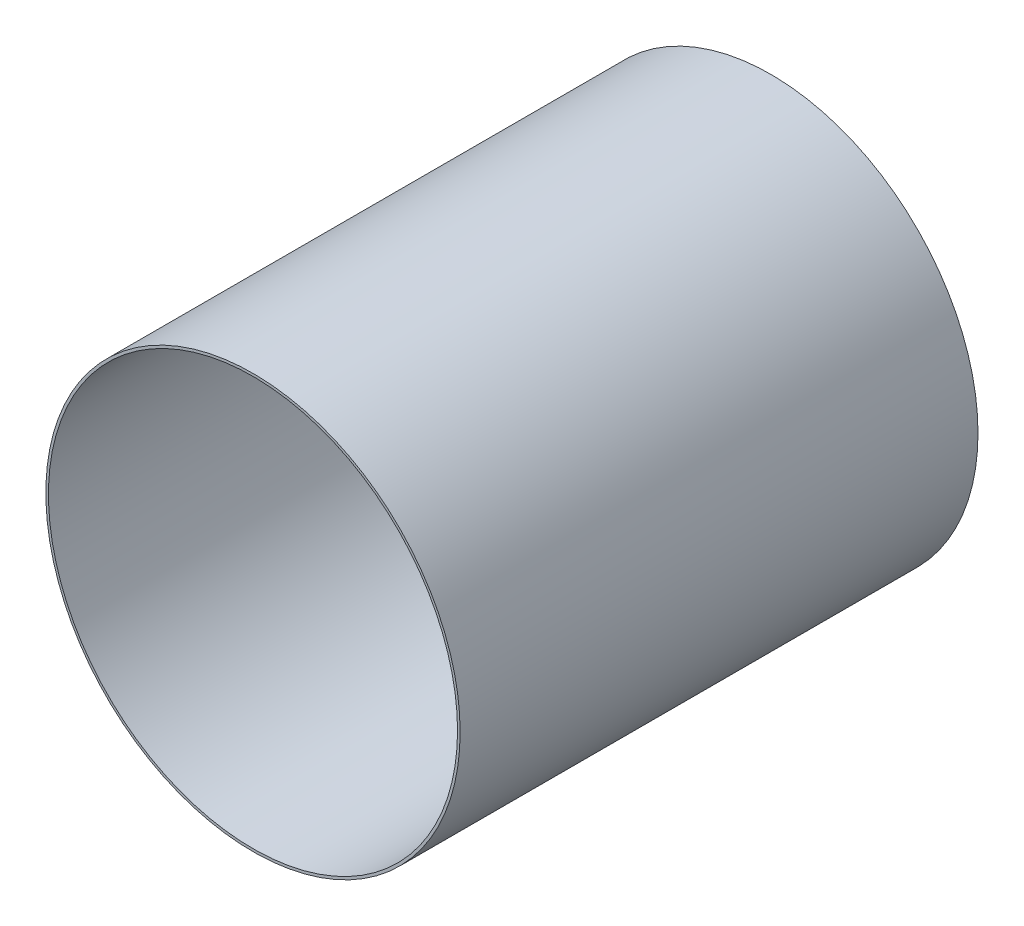
ISO-10303-21;
HEADER;
FILE_DESCRIPTION(('STEP AP214'),'2;1');
FILE_NAME('part.step','',(''),(''),'','','');
FILE_SCHEMA(('AUTOMOTIVE_DESIGN { 1 0 10303 214 1 1 1 1 }'));
ENDSEC;
DATA;
#1=APPLICATION_CONTEXT('core data for automotive mechanical design processes');
#2=APPLICATION_PROTOCOL_DEFINITION('international standard','automotive_design',2000,#1);
#3=PRODUCT_CONTEXT('',#1,'mechanical');
#4=PRODUCT('Part','Part','',(#3));
#5=PRODUCT_RELATED_PRODUCT_CATEGORY('part','',(#4));
#6=PRODUCT_DEFINITION_FORMATION('','',#4);
#7=PRODUCT_DEFINITION_CONTEXT('part definition',#1,'design');
#8=PRODUCT_DEFINITION('design','',#6,#7);
#9=PRODUCT_DEFINITION_SHAPE('','',#8);
#10=(LENGTH_UNIT() NAMED_UNIT(*) SI_UNIT(.MILLI.,.METRE.));
#11=(NAMED_UNIT(*) PLANE_ANGLE_UNIT() SI_UNIT($,.RADIAN.));
#12=(NAMED_UNIT(*) SI_UNIT($,.STERADIAN.) SOLID_ANGLE_UNIT());
#13=UNCERTAINTY_MEASURE_WITH_UNIT(LENGTH_MEASURE(1.E-05),#10,'distance_accuracy_value','');
#14=(GEOMETRIC_REPRESENTATION_CONTEXT(3) GLOBAL_UNCERTAINTY_ASSIGNED_CONTEXT((#13)) GLOBAL_UNIT_ASSIGNED_CONTEXT((#10,
#11,#12)) REPRESENTATION_CONTEXT('',''));
#15=CARTESIAN_POINT('',(0.,0.,0.));
#16=DIRECTION('',(0.,0.,1.));
#17=DIRECTION('',(1.,0.,0.));
#18=AXIS2_PLACEMENT_3D('',#15,#16,#17);
#19=CARTESIAN_POINT('',(0.,0.,10.));
#20=DIRECTION('',(0.,0.,1.));
#21=DIRECTION('',(1.,0.,0.));
#22=AXIS2_PLACEMENT_3D('',#19,#20,#21);
#23=PLANE('',#22);
#24=CARTESIAN_POINT('',(0.,0.,10.));
#25=DIRECTION('',(0.,0.,1.));
#26=DIRECTION('',(1.,0.,0.));
#27=AXIS2_PLACEMENT_3D('',#24,#25,#26);
#28=CIRCLE('',#27,4.);
#29=CARTESIAN_POINT('',(4.,0.,10.));
#30=VERTEX_POINT('',#29);
#31=EDGE_CURVE('E10',#30,#30,#28,.T.);
#32=ORIENTED_EDGE('',*,*,#31,.T.);
#33=EDGE_LOOP('',(#32));
#34=FACE_BOUND('',#33,.T.);
#35=CARTESIAN_POINT('',(0.,0.,10.));
#36=DIRECTION('',(0.,0.,1.));
#37=DIRECTION('',(1.,0.,0.));
#38=AXIS2_PLACEMENT_3D('',#35,#36,#37);
#39=CIRCLE('',#38,3.95);
#40=CARTESIAN_POINT('',(3.95,0.,10.));
#41=VERTEX_POINT('',#40);
#42=EDGE_CURVE('E50',#41,#41,#39,.T.);
#43=ORIENTED_EDGE('',*,*,#42,.F.);
#44=EDGE_LOOP('',(#43));
#45=FACE_BOUND('',#44,.T.);
#46=ADVANCED_FACE('F37',(#34,#45),#23,.T.);
#47=CARTESIAN_POINT('',(0.,0.,0.));
#48=DIRECTION('',(0.,0.,1.));
#49=DIRECTION('',(1.,0.,0.));
#50=AXIS2_PLACEMENT_3D('',#47,#48,#49);
#51=PLANE('',#50);
#52=CARTESIAN_POINT('',(0.,0.,0.));
#53=DIRECTION('',(0.,0.,1.));
#54=DIRECTION('',(1.,0.,0.));
#55=AXIS2_PLACEMENT_3D('',#52,#53,#54);
#56=CIRCLE('',#55,4.);
#57=CARTESIAN_POINT('',(4.,0.,0.));
#58=VERTEX_POINT('',#57);
#59=EDGE_CURVE('E41',#58,#58,#56,.T.);
#60=ORIENTED_EDGE('',*,*,#59,.F.);
#61=EDGE_LOOP('',(#60));
#62=FACE_BOUND('',#61,.T.);
#63=CARTESIAN_POINT('',(0.,0.,0.));
#64=DIRECTION('',(0.,0.,1.));
#65=DIRECTION('',(1.,0.,0.));
#66=AXIS2_PLACEMENT_3D('',#63,#64,#65);
#67=CIRCLE('',#66,3.95);
#68=CARTESIAN_POINT('',(3.95,0.,0.));
#69=VERTEX_POINT('',#68);
#70=EDGE_CURVE('E52',#69,#69,#67,.T.);
#71=ORIENTED_EDGE('',*,*,#70,.T.);
#72=EDGE_LOOP('',(#71));
#73=FACE_BOUND('',#72,.T.);
#74=ADVANCED_FACE('F64',(#62,#73),#51,.F.);
#75=CARTESIAN_POINT('',(0.,0.,10.));
#76=DIRECTION('',(0.,0.,-1.));
#77=DIRECTION('',(-1.,0.,0.));
#78=AXIS2_PLACEMENT_3D('',#75,#76,#77);
#79=CYLINDRICAL_SURFACE('',#78,4.);
#80=ORIENTED_EDGE('',*,*,#31,.F.);
#81=EDGE_LOOP('',(#80));
#82=FACE_BOUND('',#81,.T.);
#83=ORIENTED_EDGE('',*,*,#59,.T.);
#84=EDGE_LOOP('',(#83));
#85=FACE_BOUND('',#84,.T.);
#86=ADVANCED_FACE('F39',(#82,#85),#79,.T.);
#87=CARTESIAN_POINT('',(0.,0.,10.));
#88=DIRECTION('',(0.,0.,-1.));
#89=DIRECTION('',(-1.,0.,0.));
#90=AXIS2_PLACEMENT_3D('',#87,#88,#89);
#91=CYLINDRICAL_SURFACE('',#90,3.95);
#92=ORIENTED_EDGE('',*,*,#42,.T.);
#93=EDGE_LOOP('',(#92));
#94=FACE_BOUND('',#93,.T.);
#95=ORIENTED_EDGE('',*,*,#70,.F.);
#96=EDGE_LOOP('',(#95));
#97=FACE_BOUND('',#96,.T.);
#98=ADVANCED_FACE('F60',(#94,#97),#91,.F.);
#99=CLOSED_SHELL('',(#46,#74,#86,#98));
#100=MANIFOLD_SOLID_BREP('B2',#99);
#101=ADVANCED_BREP_SHAPE_REPRESENTATION('',(#18,#100),#14);
#102=SHAPE_DEFINITION_REPRESENTATION(#9,#101);
ENDSEC;
END-ISO-10303-21;
